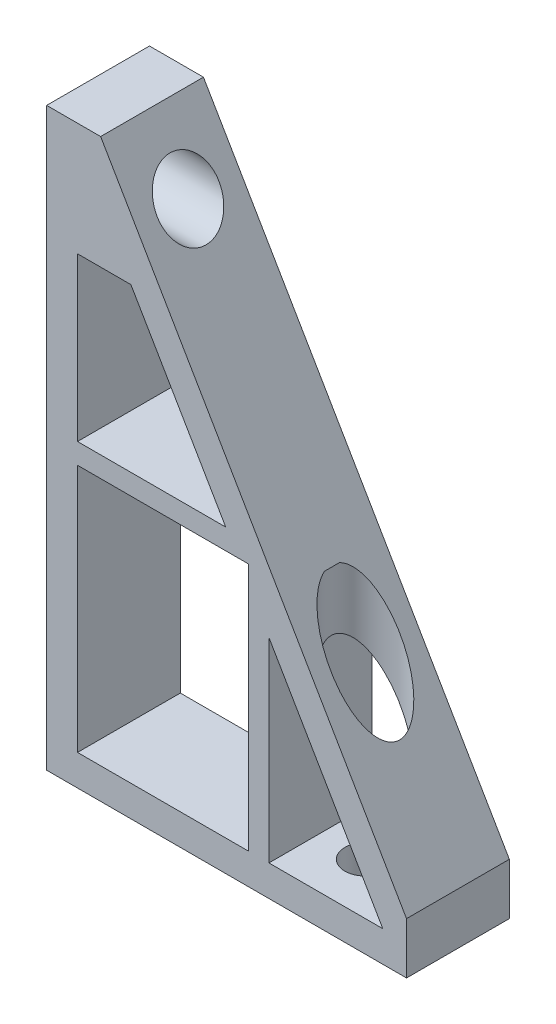
ISO-10303-21;
HEADER;
FILE_DESCRIPTION(('STEP AP214'),'2;1');
FILE_NAME('part.step','',(''),(''),'','','');
FILE_SCHEMA(('AUTOMOTIVE_DESIGN { 1 0 10303 214 1 1 1 1 }'));
ENDSEC;
DATA;
#1=APPLICATION_CONTEXT('core data for automotive mechanical design processes');
#2=APPLICATION_PROTOCOL_DEFINITION('international standard','automotive_design',2000,#1);
#3=PRODUCT_CONTEXT('',#1,'mechanical');
#4=PRODUCT('Part','Part','',(#3));
#5=PRODUCT_RELATED_PRODUCT_CATEGORY('part','',(#4));
#6=PRODUCT_DEFINITION_FORMATION('','',#4);
#7=PRODUCT_DEFINITION_CONTEXT('part definition',#1,'design');
#8=PRODUCT_DEFINITION('design','',#6,#7);
#9=PRODUCT_DEFINITION_SHAPE('','',#8);
#10=(LENGTH_UNIT() NAMED_UNIT(*) SI_UNIT(.MILLI.,.METRE.));
#11=(NAMED_UNIT(*) PLANE_ANGLE_UNIT() SI_UNIT($,.RADIAN.));
#12=(NAMED_UNIT(*) SI_UNIT($,.STERADIAN.) SOLID_ANGLE_UNIT());
#13=UNCERTAINTY_MEASURE_WITH_UNIT(LENGTH_MEASURE(1.E-05),#10,'distance_accuracy_value','');
#14=(GEOMETRIC_REPRESENTATION_CONTEXT(3) GLOBAL_UNCERTAINTY_ASSIGNED_CONTEXT((#13)) GLOBAL_UNIT_ASSIGNED_CONTEXT((#10,
#11,#12)) REPRESENTATION_CONTEXT('',''));
#15=CARTESIAN_POINT('',(0.,0.,0.));
#16=DIRECTION('',(0.,0.,1.));
#17=DIRECTION('',(1.,0.,0.));
#18=AXIS2_PLACEMENT_3D('',#15,#16,#17);
#19=CARTESIAN_POINT('',(44.45,6.35,12.7));
#20=DIRECTION('',(-0.863778900898433,-0.503871025524086,0.));
#21=DIRECTION('',(0.503871025524086,-0.863778900898434,0.));
#22=AXIS2_PLACEMENT_3D('',#19,#20,#21);
#23=PLANE('',#22);
#24=CARTESIAN_POINT('',(11.1125,63.5,6.35));
#25=DIRECTION('',(-0.863778900898433,-0.503871025524086,0.));
#26=DIRECTION('',(-0.503871025524086,0.863778900898434,0.));
#27=AXIS2_PLACEMENT_3D('',#24,#25,#26);
#28=ELLIPSE('',#27,4.41085096665031,3.81);
#29=CARTESIAN_POINT('',(8.89000000000001,67.31,6.35));
#30=VERTEX_POINT('',#29);
#31=EDGE_CURVE('E168',#30,#30,#28,.F.);
#32=ORIENTED_EDGE('',*,*,#31,.F.);
#33=EDGE_LOOP('',(#32));
#34=FACE_BOUND('',#33,.T.);
#35=DIRECTION('',(0.,0.,-1.));
#36=VECTOR('',#35,1.);
#37=CARTESIAN_POINT('',(6.6675,71.12,26.162));
#38=LINE('',#37,#36);
#39=CARTESIAN_POINT('',(6.6675,71.12,12.7));
#40=VERTEX_POINT('',#39);
#41=CARTESIAN_POINT('',(6.66750000000001,71.12,0.));
#42=VERTEX_POINT('',#41);
#43=EDGE_CURVE('E185',#40,#42,#38,.T.);
#44=ORIENTED_EDGE('',*,*,#43,.F.);
#45=DIRECTION('',(-0.503871025524086,0.863778900898434,0.));
#46=VECTOR('',#45,1.);
#47=CARTESIAN_POINT('',(44.45,6.35,12.7));
#48=LINE('',#47,#46);
#49=CARTESIAN_POINT('',(44.45,6.35,12.7));
#50=VERTEX_POINT('',#49);
#51=EDGE_CURVE('E290',#50,#40,#48,.T.);
#52=ORIENTED_EDGE('',*,*,#51,.F.);
#53=DIRECTION('',(0.,0.,-1.));
#54=VECTOR('',#53,1.);
#55=CARTESIAN_POINT('',(44.45,6.35,12.7));
#56=LINE('',#55,#54);
#57=CARTESIAN_POINT('',(44.45,6.35,0.));
#58=VERTEX_POINT('',#57);
#59=EDGE_CURVE('E294',#50,#58,#56,.T.);
#60=ORIENTED_EDGE('',*,*,#59,.T.);
#61=DIRECTION('',(-0.503871025524086,0.863778900898434,0.));
#62=VECTOR('',#61,1.);
#63=CARTESIAN_POINT('',(44.45,6.35,0.));
#64=LINE('',#63,#62);
#65=EDGE_CURVE('E284',#58,#42,#64,.T.);
#66=ORIENTED_EDGE('',*,*,#65,.T.);
#67=EDGE_LOOP('',(#44,#52,#60,#66));
#68=FACE_BOUND('',#67,.T.);
#69=CARTESIAN_POINT('',(33.02,25.9442857142857,6.35));
#70=DIRECTION('',(-0.863778900898433,-0.503871025524086,0.));
#71=DIRECTION('',(0.503871025524086,-0.863778900898434,0.));
#72=AXIS2_PLACEMENT_3D('',#69,#70,#71);
#73=ELLIPSE('',#72,8.39321926796888,4.2291);
#74=CARTESIAN_POINT('',(28.8925,33.02,7.27142854307868));
#75=VERTEX_POINT('',#74);
#76=CARTESIAN_POINT('',(28.8925,33.02,5.42857145692132));
#77=VERTEX_POINT('',#76);
#78=EDGE_CURVE('E165',#75,#77,#73,.F.);
#79=ORIENTED_EDGE('',*,*,#78,.F.);
#80=DIRECTION('',(0.,0.,-1.));
#81=VECTOR('',#80,1.);
#82=CARTESIAN_POINT('',(28.8925,33.02,12.7));
#83=LINE('',#82,#81);
#84=EDGE_CURVE('E11',#75,#77,#83,.T.);
#85=ORIENTED_EDGE('',*,*,#84,.T.);
#86=EDGE_LOOP('',(#79,#85));
#87=FACE_BOUND('',#86,.T.);
#88=ADVANCED_FACE('F41',(#34,#68,#87),#23,.F.);
#89=CARTESIAN_POINT('',(0.,82.55,12.7));
#90=DIRECTION('',(1.,0.,0.));
#91=DIRECTION('',(0.,0.,-1.));
#92=AXIS2_PLACEMENT_3D('',#89,#90,#91);
#93=PLANE('',#92);
#94=CARTESIAN_POINT('',(0.,63.5,6.35));
#95=DIRECTION('',(1.,0.,0.));
#96=DIRECTION('',(0.,0.,-1.));
#97=AXIS2_PLACEMENT_3D('',#94,#95,#96);
#98=CIRCLE('',#97,2.54);
#99=CARTESIAN_POINT('',(0.,66.04,6.35));
#100=VERTEX_POINT('',#99);
#101=EDGE_CURVE('E45',#100,#100,#98,.T.);
#102=ORIENTED_EDGE('',*,*,#101,.T.);
#103=EDGE_LOOP('',(#102));
#104=FACE_BOUND('',#103,.T.);
#105=DIRECTION('',(0.,0.,-1.));
#106=VECTOR('',#105,1.);
#107=CARTESIAN_POINT('',(0.,71.12,26.162));
#108=LINE('',#107,#106);
#109=CARTESIAN_POINT('',(0.,71.12,12.7));
#110=VERTEX_POINT('',#109);
#111=CARTESIAN_POINT('',(0.,71.12,0.));
#112=VERTEX_POINT('',#111);
#113=EDGE_CURVE('E206',#110,#112,#108,.T.);
#114=ORIENTED_EDGE('',*,*,#113,.T.);
#115=DIRECTION('',(0.,-1.,0.));
#116=VECTOR('',#115,1.);
#117=CARTESIAN_POINT('',(0.,82.55,0.));
#118=LINE('',#117,#116);
#119=CARTESIAN_POINT('',(0.,0.,0.));
#120=VERTEX_POINT('',#119);
#121=EDGE_CURVE('E279',#112,#120,#118,.T.);
#122=ORIENTED_EDGE('',*,*,#121,.T.);
#123=DIRECTION('',(0.,0.,-1.));
#124=VECTOR('',#123,1.);
#125=CARTESIAN_POINT('',(0.,0.,12.7));
#126=LINE('',#125,#124);
#127=CARTESIAN_POINT('',(0.,0.,12.7));
#128=VERTEX_POINT('',#127);
#129=EDGE_CURVE('E313',#128,#120,#126,.T.);
#130=ORIENTED_EDGE('',*,*,#129,.F.);
#131=DIRECTION('',(0.,-1.,0.));
#132=VECTOR('',#131,1.);
#133=CARTESIAN_POINT('',(0.,82.55,12.7));
#134=LINE('',#133,#132);
#135=EDGE_CURVE('E280',#110,#128,#134,.T.);
#136=ORIENTED_EDGE('',*,*,#135,.F.);
#137=EDGE_LOOP('',(#114,#122,#130,#136));
#138=FACE_BOUND('',#137,.T.);
#139=ADVANCED_FACE('F43',(#104,#138),#93,.F.);
#140=CARTESIAN_POINT('',(0.,0.,12.7));
#141=DIRECTION('',(0.,0.,1.));
#142=DIRECTION('',(1.,0.,0.));
#143=AXIS2_PLACEMENT_3D('',#140,#141,#142);
#144=PLANE('',#143);
#145=DIRECTION('',(-1.,0.,0.));
#146=VECTOR('',#145,1.);
#147=CARTESIAN_POINT('',(0.,37.0674678559907,12.7));
#148=LINE('',#147,#146);
#149=CARTESIAN_POINT('',(22.1206261173551,37.0674678559907,12.7));
#150=VERTEX_POINT('',#149);
#151=CARTESIAN_POINT('',(3.81,37.0674678559907,12.7));
#152=VERTEX_POINT('',#151);
#153=EDGE_CURVE('E239',#150,#152,#148,.T.);
#154=ORIENTED_EDGE('',*,*,#153,.T.);
#155=DIRECTION('',(0.,1.,0.));
#156=VECTOR('',#155,1.);
#157=CARTESIAN_POINT('',(3.81000000000001,0.,12.7));
#158=LINE('',#157,#156);
#159=CARTESIAN_POINT('',(3.81,57.15,12.7));
#160=VERTEX_POINT('',#159);
#161=EDGE_CURVE('E243',#152,#160,#158,.T.);
#162=ORIENTED_EDGE('',*,*,#161,.T.);
#163=DIRECTION('',(1.,0.,0.));
#164=VECTOR('',#163,1.);
#165=CARTESIAN_POINT('',(0.,57.15,12.7));
#166=LINE('',#165,#164);
#167=CARTESIAN_POINT('',(10.4058157000164,57.15,12.7));
#168=VERTEX_POINT('',#167);
#169=EDGE_CURVE('E231',#160,#168,#166,.T.);
#170=ORIENTED_EDGE('',*,*,#169,.T.);
#171=DIRECTION('',(0.503871025524086,-0.863778900898434,0.));
#172=VECTOR('',#171,1.);
#173=CARTESIAN_POINT('',(32.6374997969034,19.0385415481936,12.7));
#174=LINE('',#173,#172);
#175=EDGE_CURVE('E235',#168,#150,#174,.T.);
#176=ORIENTED_EDGE('',*,*,#175,.T.);
#177=EDGE_LOOP('',(#154,#162,#170,#176));
#178=FACE_BOUND('',#177,.T.);
#179=DIRECTION('',(-1.,0.,0.));
#180=VECTOR('',#179,1.);
#181=CARTESIAN_POINT('',(0.,3.81,12.7));
#182=LINE('',#181,#180);
#183=CARTESIAN_POINT('',(24.9150337391436,3.81,12.7));
#184=VERTEX_POINT('',#183);
#185=CARTESIAN_POINT('',(3.81,3.81,12.7));
#186=VERTEX_POINT('',#185);
#187=EDGE_CURVE('E255',#184,#186,#182,.T.);
#188=ORIENTED_EDGE('',*,*,#187,.T.);
#189=DIRECTION('',(0.,1.,0.));
#190=VECTOR('',#189,1.);
#191=CARTESIAN_POINT('',(3.81,0.,12.7));
#192=LINE('',#191,#190);
#193=CARTESIAN_POINT('',(3.81,34.5274678559907,12.7));
#194=VERTEX_POINT('',#193);
#195=EDGE_CURVE('E259',#186,#194,#192,.T.);
#196=ORIENTED_EDGE('',*,*,#195,.T.);
#197=DIRECTION('',(1.,0.,0.));
#198=VECTOR('',#197,1.);
#199=CARTESIAN_POINT('',(0.,34.5274678559907,12.7));
#200=LINE('',#199,#198);
#201=CARTESIAN_POINT('',(24.9150337391436,34.5274678559907,12.7));
#202=VERTEX_POINT('',#201);
#203=EDGE_CURVE('E247',#194,#202,#200,.T.);
#204=ORIENTED_EDGE('',*,*,#203,.T.);
#205=DIRECTION('',(0.,-1.,0.));
#206=VECTOR('',#205,1.);
#207=CARTESIAN_POINT('',(24.9150337391436,0.,12.7));
#208=LINE('',#207,#206);
#209=EDGE_CURVE('E251',#202,#184,#208,.T.);
#210=ORIENTED_EDGE('',*,*,#209,.T.);
#211=EDGE_LOOP('',(#188,#196,#204,#210));
#212=FACE_BOUND('',#211,.T.);
#213=DIRECTION('',(-1.,0.,0.));
#214=VECTOR('',#213,1.);
#215=CARTESIAN_POINT('',(0.,3.81,12.7));
#216=LINE('',#215,#214);
#217=CARTESIAN_POINT('',(41.5208157000163,3.81,12.7));
#218=VERTEX_POINT('',#217);
#219=CARTESIAN_POINT('',(27.4550337391436,3.81,12.7));
#220=VERTEX_POINT('',#219);
#221=EDGE_CURVE('E267',#218,#220,#216,.T.);
#222=ORIENTED_EDGE('',*,*,#221,.T.);
#223=DIRECTION('',(0.,1.,0.));
#224=VECTOR('',#223,1.);
#225=CARTESIAN_POINT('',(27.4550337391436,0.,12.7));
#226=LINE('',#225,#224);
#227=CARTESIAN_POINT('',(27.4550337391436,27.9227690757818,12.7));
#228=VERTEX_POINT('',#227);
#229=EDGE_CURVE('E271',#220,#228,#226,.T.);
#230=ORIENTED_EDGE('',*,*,#229,.T.);
#231=DIRECTION('',(0.503871025524086,-0.863778900898434,0.));
#232=VECTOR('',#231,1.);
#233=CARTESIAN_POINT('',(32.6374997969034,19.0385415481936,12.7));
#234=LINE('',#233,#232);
#235=EDGE_CURVE('E263',#228,#218,#234,.T.);
#236=ORIENTED_EDGE('',*,*,#235,.T.);
#237=EDGE_LOOP('',(#222,#230,#236));
#238=FACE_BOUND('',#237,.T.);
#239=ORIENTED_EDGE('',*,*,#51,.T.);
#240=DIRECTION('',(-1.,0.,0.));
#241=VECTOR('',#240,1.);
#242=CARTESIAN_POINT('',(0.,71.12,12.7));
#243=LINE('',#242,#241);
#244=EDGE_CURVE('E275',#40,#110,#243,.T.);
#245=ORIENTED_EDGE('',*,*,#244,.T.);
#246=ORIENTED_EDGE('',*,*,#135,.T.);
#247=DIRECTION('',(1.,0.,0.));
#248=VECTOR('',#247,1.);
#249=CARTESIAN_POINT('',(0.,0.,12.7));
#250=LINE('',#249,#248);
#251=CARTESIAN_POINT('',(44.45,0.,12.7));
#252=VERTEX_POINT('',#251);
#253=EDGE_CURVE('E283',#128,#252,#250,.T.);
#254=ORIENTED_EDGE('',*,*,#253,.T.);
#255=DIRECTION('',(0.,1.,0.));
#256=VECTOR('',#255,1.);
#257=CARTESIAN_POINT('',(44.45,0.,12.7));
#258=LINE('',#257,#256);
#259=EDGE_CURVE('E287',#252,#50,#258,.T.);
#260=ORIENTED_EDGE('',*,*,#259,.T.);
#261=EDGE_LOOP('',(#239,#245,#246,#254,#260));
#262=FACE_BOUND('',#261,.T.);
#263=ADVANCED_FACE('F391',(#178,#212,#238,#262),#144,.T.);
#264=CARTESIAN_POINT('',(0.,0.,0.));
#265=DIRECTION('',(0.,0.,1.));
#266=DIRECTION('',(1.,0.,0.));
#267=AXIS2_PLACEMENT_3D('',#264,#265,#266);
#268=PLANE('',#267);
#269=DIRECTION('',(0.,1.,0.));
#270=VECTOR('',#269,1.);
#271=CARTESIAN_POINT('',(27.4550337391436,0.,0.));
#272=LINE('',#271,#270);
#273=CARTESIAN_POINT('',(27.4550337391436,3.81,0.));
#274=VERTEX_POINT('',#273);
#275=CARTESIAN_POINT('',(27.4550337391436,27.9227690757818,0.));
#276=VERTEX_POINT('',#275);
#277=EDGE_CURVE('E349',#274,#276,#272,.T.);
#278=ORIENTED_EDGE('',*,*,#277,.F.);
#279=DIRECTION('',(-1.,0.,0.));
#280=VECTOR('',#279,1.);
#281=CARTESIAN_POINT('',(0.,3.81,0.));
#282=LINE('',#281,#280);
#283=CARTESIAN_POINT('',(41.5208157000163,3.81,0.));
#284=VERTEX_POINT('',#283);
#285=EDGE_CURVE('E346',#284,#274,#282,.T.);
#286=ORIENTED_EDGE('',*,*,#285,.F.);
#287=DIRECTION('',(0.503871025524086,-0.863778900898434,0.));
#288=VECTOR('',#287,1.);
#289=CARTESIAN_POINT('',(32.6374997969034,19.0385415481936,0.));
#290=LINE('',#289,#288);
#291=EDGE_CURVE('E343',#276,#284,#290,.T.);
#292=ORIENTED_EDGE('',*,*,#291,.F.);
#293=EDGE_LOOP('',(#278,#286,#292));
#294=FACE_BOUND('',#293,.T.);
#295=DIRECTION('',(0.,1.,0.));
#296=VECTOR('',#295,1.);
#297=CARTESIAN_POINT('',(3.81000000000001,0.,0.));
#298=LINE('',#297,#296);
#299=CARTESIAN_POINT('',(3.81,37.0674678559907,0.));
#300=VERTEX_POINT('',#299);
#301=CARTESIAN_POINT('',(3.81,57.15,0.));
#302=VERTEX_POINT('',#301);
#303=EDGE_CURVE('E326',#300,#302,#298,.T.);
#304=ORIENTED_EDGE('',*,*,#303,.F.);
#305=DIRECTION('',(-1.,0.,0.));
#306=VECTOR('',#305,1.);
#307=CARTESIAN_POINT('',(0.,37.0674678559907,0.));
#308=LINE('',#307,#306);
#309=CARTESIAN_POINT('',(22.1206261173551,37.0674678559907,0.));
#310=VERTEX_POINT('',#309);
#311=EDGE_CURVE('E323',#310,#300,#308,.T.);
#312=ORIENTED_EDGE('',*,*,#311,.F.);
#313=DIRECTION('',(0.503871025524086,-0.863778900898434,0.));
#314=VECTOR('',#313,1.);
#315=CARTESIAN_POINT('',(32.6374997969034,19.0385415481936,0.));
#316=LINE('',#315,#314);
#317=CARTESIAN_POINT('',(10.4058157000164,57.15,0.));
#318=VERTEX_POINT('',#317);
#319=EDGE_CURVE('E320',#318,#310,#316,.T.);
#320=ORIENTED_EDGE('',*,*,#319,.F.);
#321=DIRECTION('',(1.,0.,0.));
#322=VECTOR('',#321,1.);
#323=CARTESIAN_POINT('',(0.,57.15,0.));
#324=LINE('',#323,#322);
#325=EDGE_CURVE('E317',#302,#318,#324,.T.);
#326=ORIENTED_EDGE('',*,*,#325,.F.);
#327=EDGE_LOOP('',(#304,#312,#320,#326));
#328=FACE_BOUND('',#327,.T.);
#329=DIRECTION('',(0.,1.,0.));
#330=VECTOR('',#329,1.);
#331=CARTESIAN_POINT('',(3.81,0.,0.));
#332=LINE('',#331,#330);
#333=CARTESIAN_POINT('',(3.81,3.81,0.));
#334=VERTEX_POINT('',#333);
#335=CARTESIAN_POINT('',(3.81,34.5274678559907,0.));
#336=VERTEX_POINT('',#335);
#337=EDGE_CURVE('E339',#334,#336,#332,.T.);
#338=ORIENTED_EDGE('',*,*,#337,.F.);
#339=DIRECTION('',(-1.,0.,0.));
#340=VECTOR('',#339,1.);
#341=CARTESIAN_POINT('',(0.,3.81,0.));
#342=LINE('',#341,#340);
#343=CARTESIAN_POINT('',(24.9150337391436,3.81,0.));
#344=VERTEX_POINT('',#343);
#345=EDGE_CURVE('E336',#344,#334,#342,.T.);
#346=ORIENTED_EDGE('',*,*,#345,.F.);
#347=DIRECTION('',(0.,-1.,0.));
#348=VECTOR('',#347,1.);
#349=CARTESIAN_POINT('',(24.9150337391436,0.,0.));
#350=LINE('',#349,#348);
#351=CARTESIAN_POINT('',(24.9150337391436,34.5274678559907,0.));
#352=VERTEX_POINT('',#351);
#353=EDGE_CURVE('E333',#352,#344,#350,.T.);
#354=ORIENTED_EDGE('',*,*,#353,.F.);
#355=DIRECTION('',(1.,0.,0.));
#356=VECTOR('',#355,1.);
#357=CARTESIAN_POINT('',(0.,34.5274678559907,0.));
#358=LINE('',#357,#356);
#359=EDGE_CURVE('E330',#336,#352,#358,.T.);
#360=ORIENTED_EDGE('',*,*,#359,.F.);
#361=EDGE_LOOP('',(#338,#346,#354,#360));
#362=FACE_BOUND('',#361,.T.);
#363=DIRECTION('',(-1.,0.,0.));
#364=VECTOR('',#363,1.);
#365=CARTESIAN_POINT('',(0.,71.12,0.));
#366=LINE('',#365,#364);
#367=EDGE_CURVE('E51',#42,#112,#366,.T.);
#368=ORIENTED_EDGE('',*,*,#367,.F.);
#369=ORIENTED_EDGE('',*,*,#65,.F.);
#370=DIRECTION('',(0.,1.,0.));
#371=VECTOR('',#370,1.);
#372=CARTESIAN_POINT('',(44.45,0.,0.));
#373=LINE('',#372,#371);
#374=CARTESIAN_POINT('',(44.45,0.,0.));
#375=VERTEX_POINT('',#374);
#376=EDGE_CURVE('E300',#375,#58,#373,.T.);
#377=ORIENTED_EDGE('',*,*,#376,.F.);
#378=DIRECTION('',(1.,0.,0.));
#379=VECTOR('',#378,1.);
#380=CARTESIAN_POINT('',(0.,0.,0.));
#381=LINE('',#380,#379);
#382=EDGE_CURVE('E297',#120,#375,#381,.T.);
#383=ORIENTED_EDGE('',*,*,#382,.F.);
#384=ORIENTED_EDGE('',*,*,#121,.F.);
#385=EDGE_LOOP('',(#368,#369,#377,#383,#384));
#386=FACE_BOUND('',#385,.T.);
#387=ADVANCED_FACE('F396',(#294,#328,#362,#386),#268,.F.);
#388=CARTESIAN_POINT('',(0.,0.,12.7));
#389=DIRECTION('',(0.,1.,0.));
#390=DIRECTION('',(0.,0.,1.));
#391=AXIS2_PLACEMENT_3D('',#388,#389,#390);
#392=PLANE('',#391);
#393=CARTESIAN_POINT('',(33.02,0.,6.35));
#394=DIRECTION('',(0.,-1.,0.));
#395=DIRECTION('',(0.,0.,-1.));
#396=AXIS2_PLACEMENT_3D('',#393,#394,#395);
#397=CIRCLE('',#396,2.54);
#398=CARTESIAN_POINT('',(33.02,0.,3.81));
#399=VERTEX_POINT('',#398);
#400=EDGE_CURVE('E171',#399,#399,#397,.T.);
#401=ORIENTED_EDGE('',*,*,#400,.F.);
#402=EDGE_LOOP('',(#401));
#403=FACE_BOUND('',#402,.T.);
#404=ORIENTED_EDGE('',*,*,#382,.T.);
#405=DIRECTION('',(0.,0.,-1.));
#406=VECTOR('',#405,1.);
#407=CARTESIAN_POINT('',(44.45,0.,12.7));
#408=LINE('',#407,#406);
#409=EDGE_CURVE('E309',#252,#375,#408,.T.);
#410=ORIENTED_EDGE('',*,*,#409,.F.);
#411=ORIENTED_EDGE('',*,*,#253,.F.);
#412=ORIENTED_EDGE('',*,*,#129,.T.);
#413=EDGE_LOOP('',(#404,#410,#411,#412));
#414=FACE_BOUND('',#413,.T.);
#415=ADVANCED_FACE('F401',(#403,#414),#392,.F.);
#416=CARTESIAN_POINT('',(44.45,0.,12.7));
#417=DIRECTION('',(-1.,0.,0.));
#418=DIRECTION('',(0.,0.,1.));
#419=AXIS2_PLACEMENT_3D('',#416,#417,#418);
#420=PLANE('',#419);
#421=ORIENTED_EDGE('',*,*,#376,.T.);
#422=ORIENTED_EDGE('',*,*,#59,.F.);
#423=ORIENTED_EDGE('',*,*,#259,.F.);
#424=ORIENTED_EDGE('',*,*,#409,.T.);
#425=EDGE_LOOP('',(#421,#422,#423,#424));
#426=FACE_BOUND('',#425,.T.);
#427=ADVANCED_FACE('F398',(#426),#420,.F.);
#428=CARTESIAN_POINT('',(3.81,57.15,26.162));
#429=DIRECTION('',(1.,0.,0.));
#430=DIRECTION('',(0.,1.,0.));
#431=AXIS2_PLACEMENT_3D('',#428,#429,#430);
#432=PLANE('',#431);
#433=DIRECTION('',(0.,0.,-1.));
#434=VECTOR('',#433,1.);
#435=CARTESIAN_POINT('',(3.81,37.0674678559907,26.162));
#436=LINE('',#435,#434);
#437=EDGE_CURVE('E227',#152,#300,#436,.T.);
#438=ORIENTED_EDGE('',*,*,#437,.T.);
#439=ORIENTED_EDGE('',*,*,#303,.T.);
#440=DIRECTION('',(0.,0.,-1.));
#441=VECTOR('',#440,1.);
#442=CARTESIAN_POINT('',(3.81,57.15,26.162));
#443=LINE('',#442,#441);
#444=EDGE_CURVE('E202',#160,#302,#443,.T.);
#445=ORIENTED_EDGE('',*,*,#444,.F.);
#446=ORIENTED_EDGE('',*,*,#161,.F.);
#447=EDGE_LOOP('',(#438,#439,#445,#446));
#448=FACE_BOUND('',#447,.T.);
#449=ADVANCED_FACE('F400',(#448),#432,.T.);
#450=CARTESIAN_POINT('',(3.81,37.0674678559907,26.162));
#451=DIRECTION('',(0.,1.,0.));
#452=DIRECTION('',(0.,0.,1.));
#453=AXIS2_PLACEMENT_3D('',#450,#451,#452);
#454=PLANE('',#453);
#455=DIRECTION('',(0.,0.,-1.));
#456=VECTOR('',#455,1.);
#457=CARTESIAN_POINT('',(22.1206261173551,37.0674678559907,26.162));
#458=LINE('',#457,#456);
#459=EDGE_CURVE('E223',#150,#310,#458,.T.);
#460=ORIENTED_EDGE('',*,*,#459,.T.);
#461=ORIENTED_EDGE('',*,*,#311,.T.);
#462=ORIENTED_EDGE('',*,*,#437,.F.);
#463=ORIENTED_EDGE('',*,*,#153,.F.);
#464=EDGE_LOOP('',(#460,#461,#462,#463));
#465=FACE_BOUND('',#464,.T.);
#466=ADVANCED_FACE('F454',(#465),#454,.T.);
#467=CARTESIAN_POINT('',(22.1206261173551,37.0674678559907,26.162));
#468=DIRECTION('',(-0.863778900898434,-0.503871025524086,0.));
#469=DIRECTION('',(0.503871025524086,-0.863778900898434,0.));
#470=AXIS2_PLACEMENT_3D('',#467,#468,#469);
#471=PLANE('',#470);
#472=DIRECTION('',(0.,0.,-1.));
#473=VECTOR('',#472,1.);
#474=CARTESIAN_POINT('',(10.4058157000164,57.15,26.162));
#475=LINE('',#474,#473);
#476=EDGE_CURVE('E219',#168,#318,#475,.T.);
#477=ORIENTED_EDGE('',*,*,#476,.T.);
#478=ORIENTED_EDGE('',*,*,#319,.T.);
#479=ORIENTED_EDGE('',*,*,#459,.F.);
#480=ORIENTED_EDGE('',*,*,#175,.F.);
#481=EDGE_LOOP('',(#477,#478,#479,#480));
#482=FACE_BOUND('',#481,.T.);
#483=ADVANCED_FACE('F450',(#482),#471,.T.);
#484=CARTESIAN_POINT('',(10.4058157000164,57.15,26.162));
#485=DIRECTION('',(0.,-1.,0.));
#486=DIRECTION('',(0.,0.,-1.));
#487=AXIS2_PLACEMENT_3D('',#484,#485,#486);
#488=PLANE('',#487);
#489=ORIENTED_EDGE('',*,*,#444,.T.);
#490=ORIENTED_EDGE('',*,*,#325,.T.);
#491=ORIENTED_EDGE('',*,*,#476,.F.);
#492=ORIENTED_EDGE('',*,*,#169,.F.);
#493=EDGE_LOOP('',(#489,#490,#491,#492));
#494=FACE_BOUND('',#493,.T.);
#495=ADVANCED_FACE('F446',(#494),#488,.T.);
#496=CARTESIAN_POINT('',(3.81,3.81,26.162));
#497=DIRECTION('',(1.,0.,0.));
#498=DIRECTION('',(0.,1.,0.));
#499=AXIS2_PLACEMENT_3D('',#496,#497,#498);
#500=PLANE('',#499);
#501=DIRECTION('',(0.,0.,-1.));
#502=VECTOR('',#501,1.);
#503=CARTESIAN_POINT('',(3.81,3.81,26.162));
#504=LINE('',#503,#502);
#505=EDGE_CURVE('E198',#186,#334,#504,.T.);
#506=ORIENTED_EDGE('',*,*,#505,.T.);
#507=ORIENTED_EDGE('',*,*,#337,.T.);
#508=DIRECTION('',(0.,0.,-1.));
#509=VECTOR('',#508,1.);
#510=CARTESIAN_POINT('',(3.81,34.5274678559907,26.162));
#511=LINE('',#510,#509);
#512=EDGE_CURVE('E186',#194,#336,#511,.T.);
#513=ORIENTED_EDGE('',*,*,#512,.F.);
#514=ORIENTED_EDGE('',*,*,#195,.F.);
#515=EDGE_LOOP('',(#506,#507,#513,#514));
#516=FACE_BOUND('',#515,.T.);
#517=ADVANCED_FACE('F449',(#516),#500,.T.);
#518=CARTESIAN_POINT('',(24.9150337391436,3.81,26.162));
#519=DIRECTION('',(0.,1.,0.));
#520=DIRECTION('',(-1.,0.,0.));
#521=AXIS2_PLACEMENT_3D('',#518,#519,#520);
#522=PLANE('',#521);
#523=DIRECTION('',(0.,0.,-1.));
#524=VECTOR('',#523,1.);
#525=CARTESIAN_POINT('',(24.9150337391436,3.81,26.162));
#526=LINE('',#525,#524);
#527=EDGE_CURVE('E194',#184,#344,#526,.T.);
#528=ORIENTED_EDGE('',*,*,#527,.T.);
#529=ORIENTED_EDGE('',*,*,#345,.T.);
#530=ORIENTED_EDGE('',*,*,#505,.F.);
#531=ORIENTED_EDGE('',*,*,#187,.F.);
#532=EDGE_LOOP('',(#528,#529,#530,#531));
#533=FACE_BOUND('',#532,.T.);
#534=ADVANCED_FACE('F488',(#533),#522,.T.);
#535=CARTESIAN_POINT('',(24.9150337391436,34.5274678559907,26.162));
#536=DIRECTION('',(-1.,0.,0.));
#537=DIRECTION('',(0.,0.,1.));
#538=AXIS2_PLACEMENT_3D('',#535,#536,#537);
#539=PLANE('',#538);
#540=DIRECTION('',(0.,0.,-1.));
#541=VECTOR('',#540,1.);
#542=CARTESIAN_POINT('',(24.9150337391436,34.5274678559907,26.162));
#543=LINE('',#542,#541);
#544=EDGE_CURVE('E189',#202,#352,#543,.T.);
#545=ORIENTED_EDGE('',*,*,#544,.T.);
#546=ORIENTED_EDGE('',*,*,#353,.T.);
#547=ORIENTED_EDGE('',*,*,#527,.F.);
#548=ORIENTED_EDGE('',*,*,#209,.F.);
#549=EDGE_LOOP('',(#545,#546,#547,#548));
#550=FACE_BOUND('',#549,.T.);
#551=ADVANCED_FACE('F492',(#550),#539,.T.);
#552=CARTESIAN_POINT('',(3.81,34.5274678559907,26.162));
#553=DIRECTION('',(0.,-1.,0.));
#554=DIRECTION('',(0.,0.,-1.));
#555=AXIS2_PLACEMENT_3D('',#552,#553,#554);
#556=PLANE('',#555);
#557=ORIENTED_EDGE('',*,*,#512,.T.);
#558=ORIENTED_EDGE('',*,*,#359,.T.);
#559=ORIENTED_EDGE('',*,*,#544,.F.);
#560=ORIENTED_EDGE('',*,*,#203,.F.);
#561=EDGE_LOOP('',(#557,#558,#559,#560));
#562=FACE_BOUND('',#561,.T.);
#563=ADVANCED_FACE('F494',(#562),#556,.T.);
#564=CARTESIAN_POINT('',(27.4550337391436,27.9227690757818,26.162));
#565=DIRECTION('',(1.,0.,0.));
#566=DIRECTION('',(0.,1.,0.));
#567=AXIS2_PLACEMENT_3D('',#564,#565,#566);
#568=PLANE('',#567);
#569=DIRECTION('',(0.,0.,-1.));
#570=VECTOR('',#569,1.);
#571=CARTESIAN_POINT('',(27.4550337391436,3.81,26.162));
#572=LINE('',#571,#570);
#573=EDGE_CURVE('E190',#220,#274,#572,.T.);
#574=ORIENTED_EDGE('',*,*,#573,.T.);
#575=ORIENTED_EDGE('',*,*,#277,.T.);
#576=DIRECTION('',(0.,0.,-1.));
#577=VECTOR('',#576,1.);
#578=CARTESIAN_POINT('',(27.4550337391436,27.9227690757818,26.162));
#579=LINE('',#578,#577);
#580=EDGE_CURVE('E203',#228,#276,#579,.T.);
#581=ORIENTED_EDGE('',*,*,#580,.F.);
#582=ORIENTED_EDGE('',*,*,#229,.F.);
#583=EDGE_LOOP('',(#574,#575,#581,#582));
#584=FACE_BOUND('',#583,.T.);
#585=ADVANCED_FACE('F444',(#584),#568,.T.);
#586=CARTESIAN_POINT('',(27.4550337391436,3.81,26.162));
#587=DIRECTION('',(0.,1.,0.));
#588=DIRECTION('',(-1.,0.,0.));
#589=AXIS2_PLACEMENT_3D('',#586,#587,#588);
#590=PLANE('',#589);
#591=DIRECTION('',(0.,0.,-1.));
#592=VECTOR('',#591,1.);
#593=CARTESIAN_POINT('',(41.5208157000163,3.81,26.162));
#594=LINE('',#593,#592);
#595=EDGE_CURVE('E66',#218,#284,#594,.T.);
#596=ORIENTED_EDGE('',*,*,#595,.T.);
#597=ORIENTED_EDGE('',*,*,#285,.T.);
#598=ORIENTED_EDGE('',*,*,#573,.F.);
#599=ORIENTED_EDGE('',*,*,#221,.F.);
#600=EDGE_LOOP('',(#596,#597,#598,#599));
#601=FACE_BOUND('',#600,.T.);
#602=CARTESIAN_POINT('',(33.02,3.81,6.35));
#603=DIRECTION('',(0.,1.,0.));
#604=DIRECTION('',(-1.,0.,0.));
#605=AXIS2_PLACEMENT_3D('',#602,#603,#604);
#606=CIRCLE('',#605,2.54);
#607=CARTESIAN_POINT('',(30.48,3.81,6.35));
#608=VERTEX_POINT('',#607);
#609=EDGE_CURVE('E176',#608,#608,#606,.T.);
#610=ORIENTED_EDGE('',*,*,#609,.F.);
#611=EDGE_LOOP('',(#610));
#612=FACE_BOUND('',#611,.T.);
#613=ADVANCED_FACE('F439',(#601,#612),#590,.T.);
#614=CARTESIAN_POINT('',(41.5208157000163,3.81,26.162));
#615=DIRECTION('',(-0.863778900898433,-0.503871025524086,0.));
#616=DIRECTION('',(0.503871025524086,-0.863778900898434,0.));
#617=AXIS2_PLACEMENT_3D('',#614,#615,#616);
#618=PLANE('',#617);
#619=CARTESIAN_POINT('',(33.02,18.3828269143138,6.35));
#620=DIRECTION('',(-0.863778900898433,-0.503871025524086,0.));
#621=DIRECTION('',(0.503871025524086,-0.863778900898433,0.));
#622=AXIS2_PLACEMENT_3D('',#619,#620,#621);
#623=ELLIPSE('',#622,8.39321926796888,4.2291);
#624=CARTESIAN_POINT('',(37.2491,11.132941200028,6.35));
#625=VERTEX_POINT('',#624);
#626=EDGE_CURVE('E167',#625,#625,#623,.F.);
#627=ORIENTED_EDGE('',*,*,#626,.T.);
#628=EDGE_LOOP('',(#627));
#629=FACE_BOUND('',#628,.T.);
#630=ORIENTED_EDGE('',*,*,#580,.T.);
#631=ORIENTED_EDGE('',*,*,#291,.T.);
#632=ORIENTED_EDGE('',*,*,#595,.F.);
#633=ORIENTED_EDGE('',*,*,#235,.F.);
#634=EDGE_LOOP('',(#630,#631,#632,#633));
#635=FACE_BOUND('',#634,.T.);
#636=ADVANCED_FACE('F431',(#629,#635),#618,.T.);
#637=CARTESIAN_POINT('',(6.6675,71.12,26.162));
#638=DIRECTION('',(0.,1.,0.));
#639=DIRECTION('',(0.,0.,1.));
#640=AXIS2_PLACEMENT_3D('',#637,#638,#639);
#641=PLANE('',#640);
#642=ORIENTED_EDGE('',*,*,#43,.T.);
#643=ORIENTED_EDGE('',*,*,#367,.T.);
#644=ORIENTED_EDGE('',*,*,#113,.F.);
#645=ORIENTED_EDGE('',*,*,#244,.F.);
#646=EDGE_LOOP('',(#642,#643,#644,#645));
#647=FACE_BOUND('',#646,.T.);
#648=ADVANCED_FACE('F428',(#647),#641,.T.);
#649=CARTESIAN_POINT('',(33.02,50.8,6.35));
#650=DIRECTION('',(0.,-1.,0.));
#651=DIRECTION('',(0.,0.,-1.));
#652=AXIS2_PLACEMENT_3D('',#649,#650,#651);
#653=CYLINDRICAL_SURFACE('',#652,2.54);
#654=ORIENTED_EDGE('',*,*,#609,.T.);
#655=EDGE_LOOP('',(#654));
#656=FACE_BOUND('',#655,.T.);
#657=ORIENTED_EDGE('',*,*,#400,.T.);
#658=EDGE_LOOP('',(#657));
#659=FACE_BOUND('',#658,.T.);
#660=ADVANCED_FACE('F430',(#656,#659),#653,.F.);
#661=CARTESIAN_POINT('',(33.02,33.02,6.35));
#662=DIRECTION('',(0.,1.,0.));
#663=DIRECTION('',(0.,0.,1.));
#664=AXIS2_PLACEMENT_3D('',#661,#662,#663);
#665=PLANE('',#664);
#666=CARTESIAN_POINT('',(33.02,33.02,6.35));
#667=DIRECTION('',(0.,1.,0.));
#668=DIRECTION('',(0.,0.,1.));
#669=AXIS2_PLACEMENT_3D('',#666,#667,#668);
#670=CIRCLE('',#669,4.2291);
#671=EDGE_CURVE('E58',#77,#75,#670,.T.);
#672=ORIENTED_EDGE('',*,*,#671,.F.);
#673=ORIENTED_EDGE('',*,*,#84,.F.);
#674=EDGE_LOOP('',(#672,#673));
#675=FACE_BOUND('',#674,.T.);
#676=ADVANCED_FACE('F160',(#675),#665,.F.);
#677=CARTESIAN_POINT('',(33.02,33.02,6.35));
#678=DIRECTION('',(0.,-1.,0.));
#679=DIRECTION('',(0.,0.,-1.));
#680=AXIS2_PLACEMENT_3D('',#677,#678,#679);
#681=CYLINDRICAL_SURFACE('',#680,4.2291);
#682=ORIENTED_EDGE('',*,*,#626,.F.);
#683=EDGE_LOOP('',(#682));
#684=FACE_BOUND('',#683,.T.);
#685=ORIENTED_EDGE('',*,*,#78,.T.);
#686=ORIENTED_EDGE('',*,*,#671,.T.);
#687=EDGE_LOOP('',(#685,#686));
#688=FACE_BOUND('',#687,.T.);
#689=ADVANCED_FACE('F164',(#684,#688),#681,.F.);
#690=CARTESIAN_POINT('',(16.51,63.5,6.35));
#691=DIRECTION('',(-1.,0.,0.));
#692=DIRECTION('',(0.,-1.,0.));
#693=AXIS2_PLACEMENT_3D('',#690,#691,#692);
#694=CYLINDRICAL_SURFACE('',#693,3.81);
#695=CARTESIAN_POINT('',(3.80999999999999,63.5,6.35));
#696=DIRECTION('',(1.,0.,0.));
#697=DIRECTION('',(0.,1.,0.));
#698=AXIS2_PLACEMENT_3D('',#695,#696,#697);
#699=CIRCLE('',#698,3.81);
#700=CARTESIAN_POINT('',(3.80999999999999,67.31,6.35));
#701=VERTEX_POINT('',#700);
#702=EDGE_CURVE('E356',#701,#701,#699,.T.);
#703=ORIENTED_EDGE('',*,*,#702,.F.);
#704=EDGE_LOOP('',(#703));
#705=FACE_BOUND('',#704,.T.);
#706=ORIENTED_EDGE('',*,*,#31,.T.);
#707=EDGE_LOOP('',(#706));
#708=FACE_BOUND('',#707,.T.);
#709=ADVANCED_FACE('F376',(#705,#708),#694,.F.);
#710=CARTESIAN_POINT('',(3.80999999999999,63.5,6.35));
#711=DIRECTION('',(1.,0.,0.));
#712=DIRECTION('',(0.,1.,0.));
#713=AXIS2_PLACEMENT_3D('',#710,#711,#712);
#714=PLANE('',#713);
#715=CARTESIAN_POINT('',(3.80999999999999,63.5,6.35));
#716=DIRECTION('',(1.,0.,0.));
#717=DIRECTION('',(0.,1.,0.));
#718=AXIS2_PLACEMENT_3D('',#715,#716,#717);
#719=CIRCLE('',#718,2.54);
#720=CARTESIAN_POINT('',(3.80999999999999,66.04,6.35));
#721=VERTEX_POINT('',#720);
#722=EDGE_CURVE('E365',#721,#721,#719,.T.);
#723=ORIENTED_EDGE('',*,*,#722,.F.);
#724=EDGE_LOOP('',(#723));
#725=FACE_BOUND('',#724,.T.);
#726=ORIENTED_EDGE('',*,*,#702,.T.);
#727=EDGE_LOOP('',(#726));
#728=FACE_BOUND('',#727,.T.);
#729=ADVANCED_FACE('F374',(#725,#728),#714,.T.);
#730=CARTESIAN_POINT('',(-8.89000000000001,63.5,6.35));
#731=DIRECTION('',(1.,0.,0.));
#732=DIRECTION('',(0.,1.,0.));
#733=AXIS2_PLACEMENT_3D('',#730,#731,#732);
#734=CYLINDRICAL_SURFACE('',#733,2.54);
#735=CARTESIAN_POINT('',(3.80999999999999,66.04,6.35));
#736=CARTESIAN_POINT('',(3.77031249999999,66.04,6.35));
#737=CARTESIAN_POINT('',(3.73062499999999,66.04,6.35));
#738=CARTESIAN_POINT('',(3.65124999999999,66.04,6.35));
#739=CARTESIAN_POINT('',(3.61156249999999,66.04,6.35));
#740=CARTESIAN_POINT('',(3.53218749999999,66.04,6.35));
#741=CARTESIAN_POINT('',(3.49249999999999,66.04,6.35));
#742=CARTESIAN_POINT('',(3.41312499999999,66.04,6.35));
#743=CARTESIAN_POINT('',(3.37343749999999,66.04,6.35));
#744=CARTESIAN_POINT('',(3.29406249999999,66.04,6.35));
#745=CARTESIAN_POINT('',(3.25437499999999,66.04,6.35));
#746=CARTESIAN_POINT('',(3.17499999999999,66.04,6.35));
#747=CARTESIAN_POINT('',(3.13531249999999,66.04,6.35));
#748=CARTESIAN_POINT('',(3.05593749999999,66.04,6.35));
#749=CARTESIAN_POINT('',(3.01624999999999,66.04,6.35));
#750=CARTESIAN_POINT('',(2.93687499999999,66.04,6.35));
#751=CARTESIAN_POINT('',(2.89718749999999,66.04,6.35));
#752=CARTESIAN_POINT('',(2.81781249999999,66.04,6.35));
#753=CARTESIAN_POINT('',(2.77812499999999,66.04,6.35));
#754=CARTESIAN_POINT('',(2.69874999999999,66.04,6.35));
#755=CARTESIAN_POINT('',(2.65906249999999,66.04,6.35));
#756=CARTESIAN_POINT('',(2.57968749999999,66.04,6.35));
#757=CARTESIAN_POINT('',(2.53999999999999,66.04,6.35));
#758=CARTESIAN_POINT('',(2.46062499999999,66.04,6.35));
#759=CARTESIAN_POINT('',(2.42093749999999,66.04,6.35));
#760=CARTESIAN_POINT('',(2.34156249999999,66.04,6.35));
#761=CARTESIAN_POINT('',(2.30187499999999,66.04,6.35));
#762=CARTESIAN_POINT('',(2.22249999999999,66.04,6.35));
#763=CARTESIAN_POINT('',(2.18281249999999,66.04,6.35));
#764=CARTESIAN_POINT('',(2.10343749999999,66.04,6.35));
#765=CARTESIAN_POINT('',(2.06374999999999,66.04,6.35));
#766=CARTESIAN_POINT('',(1.98437499999999,66.04,6.35));
#767=CARTESIAN_POINT('',(1.94468749999999,66.04,6.35));
#768=CARTESIAN_POINT('',(1.86531249999999,66.04,6.35));
#769=CARTESIAN_POINT('',(1.82562499999999,66.04,6.35));
#770=CARTESIAN_POINT('',(1.74624999999999,66.04,6.35));
#771=CARTESIAN_POINT('',(1.70656249999999,66.04,6.35));
#772=CARTESIAN_POINT('',(1.62718749999999,66.04,6.35));
#773=CARTESIAN_POINT('',(1.58749999999999,66.04,6.35));
#774=CARTESIAN_POINT('',(1.50812499999999,66.04,6.35));
#775=CARTESIAN_POINT('',(1.46843749999999,66.04,6.35));
#776=CARTESIAN_POINT('',(1.38906249999999,66.04,6.35));
#777=CARTESIAN_POINT('',(1.34937499999999,66.04,6.35));
#778=CARTESIAN_POINT('',(1.27,66.04,6.35));
#779=CARTESIAN_POINT('',(1.2303125,66.04,6.35));
#780=CARTESIAN_POINT('',(1.1509375,66.04,6.35));
#781=CARTESIAN_POINT('',(1.11125,66.04,6.35));
#782=CARTESIAN_POINT('',(1.031875,66.04,6.35));
#783=CARTESIAN_POINT('',(0.992187499999997,66.04,6.35));
#784=CARTESIAN_POINT('',(0.912812499999996,66.04,6.35));
#785=CARTESIAN_POINT('',(0.873124999999996,66.04,6.35));
#786=CARTESIAN_POINT('',(0.793749999999996,66.04,6.35));
#787=CARTESIAN_POINT('',(0.754062499999996,66.04,6.35));
#788=CARTESIAN_POINT('',(0.674687499999996,66.04,6.35));
#789=CARTESIAN_POINT('',(0.634999999999997,66.04,6.35));
#790=CARTESIAN_POINT('',(0.555624999999997,66.04,6.35));
#791=CARTESIAN_POINT('',(0.515937499999997,66.04,6.35));
#792=CARTESIAN_POINT('',(0.436562499999997,66.04,6.35));
#793=CARTESIAN_POINT('',(0.396874999999997,66.04,6.35));
#794=CARTESIAN_POINT('',(0.317499999999997,66.04,6.35));
#795=CARTESIAN_POINT('',(0.277812499999997,66.04,6.35));
#796=CARTESIAN_POINT('',(0.198437499999997,66.04,6.35));
#797=CARTESIAN_POINT('',(0.158749999999997,66.04,6.35));
#798=CARTESIAN_POINT('',(0.0793749999999979,66.04,6.35));
#799=CARTESIAN_POINT('',(0.0396874999999981,66.04,6.35));
#800=CARTESIAN_POINT('',(0.,66.04,6.35));
#801=B_SPLINE_CURVE_WITH_KNOTS('',3,(#735,#736,#737,#738,#739,#740,#741,#742,#743,#744,#745,
#746,#747,#748,#749,#750,#751,#752,#753,#754,#755,#756,#757,#758,#759,#760,#761,#762,#763,#764,
#765,#766,#767,#768,#769,#770,#771,#772,#773,#774,#775,#776,#777,#778,#779,#780,#781,#782,#783,
#784,#785,#786,#787,#788,#789,#790,#791,#792,#793,#794,#795,#796,#797,#798,#799,#800),
.UNSPECIFIED.,.F.,.F.,(4,2,2,2,2,2,2,2,2,2,2,2,2,2,2,2,2,2,2,2,2,2,2,2,2,2,2,2,2,2,2,2,4),(0.,
0.119062499999999,0.238124999999999,0.3571875,0.476249999999999,0.595312499999999,
0.714374999999998,0.833437499999997,0.952499999999998,1.0715625,1.190625,1.3096875,1.42875,
1.5478125,1.666875,1.7859375,1.905,2.02406249999999,2.143125,2.2621875,2.38124999999999,
2.50031249999999,2.61937499999999,2.73843749999999,2.85749999999999,2.97656249999999,
3.09562499999999,3.21468749999999,3.33374999999999,3.45281249999999,3.57187499999999,
3.69093749999999,3.80999999999999),.UNSPECIFIED.);
#802=EDGE_CURVE('BSEAM371',#721,#100,#801,.T.);
#803=ORIENTED_EDGE('',*,*,#722,.T.);
#804=ORIENTED_EDGE('',*,*,#101,.F.);
#805=ORIENTED_EDGE('',*,*,#802,.T.);
#806=ORIENTED_EDGE('',*,*,#802,.F.);
#807=EDGE_LOOP('',(#803,#805,#804,#806));
#808=FACE_BOUND('',#807,.T.);
#809=ADVANCED_FACE('F371',(#808),#734,.F.);
#810=CLOSED_SHELL('',(#88,#139,#263,#387,#415,#427,#449,#466,#483,#495,#517,#534,#551,#563,#585,
#613,#636,#648,#660,#676,#689,#709,#729,#809));
#811=MANIFOLD_SOLID_BREP('B2',#810);
#812=ADVANCED_BREP_SHAPE_REPRESENTATION('',(#18,#811),#14);
#813=SHAPE_DEFINITION_REPRESENTATION(#9,#812);
ENDSEC;
END-ISO-10303-21;
